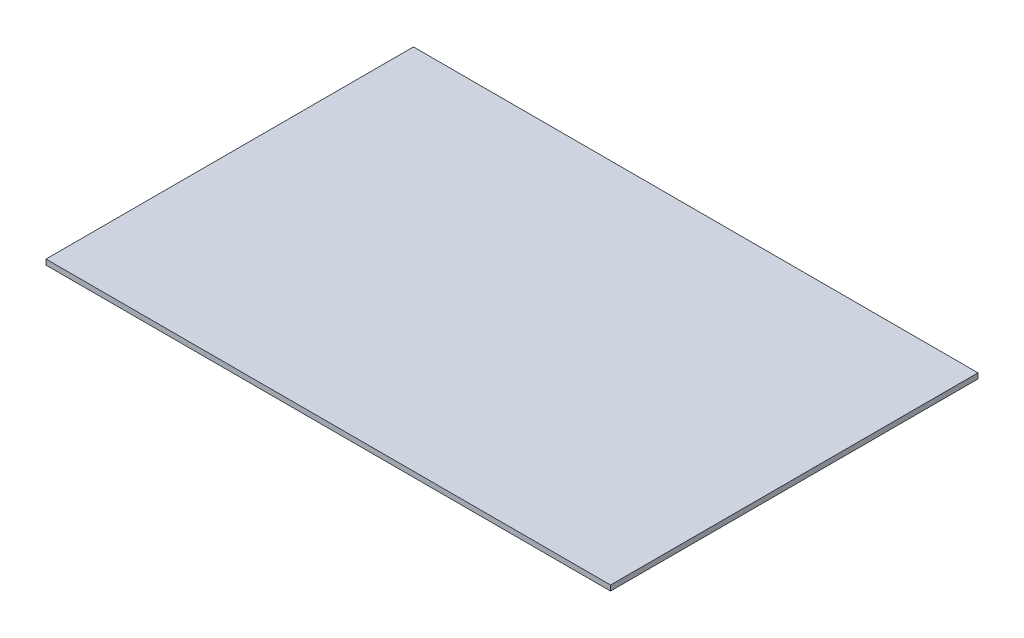
ISO-10303-21;
HEADER;
FILE_DESCRIPTION(('STEP AP214'),'2;1');
FILE_NAME('part.step','',(''),(''),'','','');
FILE_SCHEMA(('AUTOMOTIVE_DESIGN { 1 0 10303 214 1 1 1 1 }'));
ENDSEC;
DATA;
#1=APPLICATION_CONTEXT('core data for automotive mechanical design processes');
#2=APPLICATION_PROTOCOL_DEFINITION('international standard','automotive_design',2000,#1);
#3=PRODUCT_CONTEXT('',#1,'mechanical');
#4=PRODUCT('Part','Part','',(#3));
#5=PRODUCT_RELATED_PRODUCT_CATEGORY('part','',(#4));
#6=PRODUCT_DEFINITION_FORMATION('','',#4);
#7=PRODUCT_DEFINITION_CONTEXT('part definition',#1,'design');
#8=PRODUCT_DEFINITION('design','',#6,#7);
#9=PRODUCT_DEFINITION_SHAPE('','',#8);
#10=(LENGTH_UNIT() NAMED_UNIT(*) SI_UNIT(.MILLI.,.METRE.));
#11=(NAMED_UNIT(*) PLANE_ANGLE_UNIT() SI_UNIT($,.RADIAN.));
#12=(NAMED_UNIT(*) SI_UNIT($,.STERADIAN.) SOLID_ANGLE_UNIT());
#13=UNCERTAINTY_MEASURE_WITH_UNIT(LENGTH_MEASURE(1.E-05),#10,'distance_accuracy_value','');
#14=(GEOMETRIC_REPRESENTATION_CONTEXT(3) GLOBAL_UNCERTAINTY_ASSIGNED_CONTEXT((#13)) GLOBAL_UNIT_ASSIGNED_CONTEXT((#10,
#11,#12)) REPRESENTATION_CONTEXT('',''));
#15=CARTESIAN_POINT('',(0.,0.,0.));
#16=DIRECTION('',(0.,0.,1.));
#17=DIRECTION('',(1.,0.,0.));
#18=AXIS2_PLACEMENT_3D('',#15,#16,#17);
#19=CARTESIAN_POINT('',(160.,3.,-104.14));
#20=DIRECTION('',(-1.,0.,0.));
#21=DIRECTION('',(0.,0.,1.));
#22=AXIS2_PLACEMENT_3D('',#19,#20,#21);
#23=PLANE('',#22);
#24=DIRECTION('',(0.,0.,-1.));
#25=VECTOR('',#24,1.);
#26=CARTESIAN_POINT('',(160.,0.,-104.14));
#27=LINE('',#26,#25);
#28=CARTESIAN_POINT('',(160.,0.,104.14));
#29=VERTEX_POINT('',#28);
#30=CARTESIAN_POINT('',(160.,0.,-104.14));
#31=VERTEX_POINT('',#30);
#32=EDGE_CURVE('E98',#29,#31,#27,.T.);
#33=ORIENTED_EDGE('',*,*,#32,.T.);
#34=DIRECTION('',(0.,-1.,0.));
#35=VECTOR('',#34,1.);
#36=CARTESIAN_POINT('',(160.,3.,-104.14));
#37=LINE('',#36,#35);
#38=CARTESIAN_POINT('',(160.,3.,-104.14));
#39=VERTEX_POINT('',#38);
#40=EDGE_CURVE('E11',#39,#31,#37,.T.);
#41=ORIENTED_EDGE('',*,*,#40,.F.);
#42=DIRECTION('',(0.,0.,-1.));
#43=VECTOR('',#42,1.);
#44=CARTESIAN_POINT('',(160.,3.,-104.14));
#45=LINE('',#44,#43);
#46=CARTESIAN_POINT('',(160.,3.,104.14));
#47=VERTEX_POINT('',#46);
#48=EDGE_CURVE('E86',#47,#39,#45,.T.);
#49=ORIENTED_EDGE('',*,*,#48,.F.);
#50=DIRECTION('',(0.,-1.,0.));
#51=VECTOR('',#50,1.);
#52=CARTESIAN_POINT('',(160.,3.,104.14));
#53=LINE('',#52,#51);
#54=EDGE_CURVE('E94',#47,#29,#53,.T.);
#55=ORIENTED_EDGE('',*,*,#54,.T.);
#56=EDGE_LOOP('',(#33,#41,#49,#55));
#57=FACE_BOUND('',#56,.T.);
#58=ADVANCED_FACE('F35',(#57),#23,.F.);
#59=CARTESIAN_POINT('',(-160.,3.,-104.14));
#60=DIRECTION('',(0.,0.,1.));
#61=DIRECTION('',(1.,0.,0.));
#62=AXIS2_PLACEMENT_3D('',#59,#60,#61);
#63=PLANE('',#62);
#64=DIRECTION('',(-1.,0.,0.));
#65=VECTOR('',#64,1.);
#66=CARTESIAN_POINT('',(-160.,0.,-104.14));
#67=LINE('',#66,#65);
#68=CARTESIAN_POINT('',(-160.,0.,-104.14));
#69=VERTEX_POINT('',#68);
#70=EDGE_CURVE('E90',#31,#69,#67,.T.);
#71=ORIENTED_EDGE('',*,*,#70,.T.);
#72=DIRECTION('',(0.,-1.,0.));
#73=VECTOR('',#72,1.);
#74=CARTESIAN_POINT('',(-160.,3.,-104.14));
#75=LINE('',#74,#73);
#76=CARTESIAN_POINT('',(-160.,3.,-104.14));
#77=VERTEX_POINT('',#76);
#78=EDGE_CURVE('E43',#77,#69,#75,.T.);
#79=ORIENTED_EDGE('',*,*,#78,.F.);
#80=DIRECTION('',(-1.,0.,0.));
#81=VECTOR('',#80,1.);
#82=CARTESIAN_POINT('',(-160.,3.,-104.14));
#83=LINE('',#82,#81);
#84=EDGE_CURVE('E81',#39,#77,#83,.T.);
#85=ORIENTED_EDGE('',*,*,#84,.F.);
#86=ORIENTED_EDGE('',*,*,#40,.T.);
#87=EDGE_LOOP('',(#71,#79,#85,#86));
#88=FACE_BOUND('',#87,.T.);
#89=ADVANCED_FACE('F89',(#88),#63,.F.);
#90=CARTESIAN_POINT('',(-160.,3.,-104.14));
#91=DIRECTION('',(1.,0.,0.));
#92=DIRECTION('',(0.,0.,-1.));
#93=AXIS2_PLACEMENT_3D('',#90,#91,#92);
#94=PLANE('',#93);
#95=DIRECTION('',(0.,0.,1.));
#96=VECTOR('',#95,1.);
#97=CARTESIAN_POINT('',(-160.,0.,-104.14));
#98=LINE('',#97,#96);
#99=CARTESIAN_POINT('',(-160.,0.,104.14));
#100=VERTEX_POINT('',#99);
#101=EDGE_CURVE('E68',#69,#100,#98,.T.);
#102=ORIENTED_EDGE('',*,*,#101,.T.);
#103=DIRECTION('',(0.,-1.,0.));
#104=VECTOR('',#103,1.);
#105=CARTESIAN_POINT('',(-160.,3.,104.14));
#106=LINE('',#105,#104);
#107=CARTESIAN_POINT('',(-160.,3.,104.14));
#108=VERTEX_POINT('',#107);
#109=EDGE_CURVE('E91',#108,#100,#106,.T.);
#110=ORIENTED_EDGE('',*,*,#109,.F.);
#111=DIRECTION('',(0.,0.,1.));
#112=VECTOR('',#111,1.);
#113=CARTESIAN_POINT('',(-160.,3.,-104.14));
#114=LINE('',#113,#112);
#115=EDGE_CURVE('E84',#77,#108,#114,.T.);
#116=ORIENTED_EDGE('',*,*,#115,.F.);
#117=ORIENTED_EDGE('',*,*,#78,.T.);
#118=EDGE_LOOP('',(#102,#110,#116,#117));
#119=FACE_BOUND('',#118,.T.);
#120=ADVANCED_FACE('F92',(#119),#94,.F.);
#121=CARTESIAN_POINT('',(-160.,3.,104.14));
#122=DIRECTION('',(0.,0.,-1.));
#123=DIRECTION('',(-1.,0.,0.));
#124=AXIS2_PLACEMENT_3D('',#121,#122,#123);
#125=PLANE('',#124);
#126=DIRECTION('',(1.,0.,0.));
#127=VECTOR('',#126,1.);
#128=CARTESIAN_POINT('',(-160.,0.,104.14));
#129=LINE('',#128,#127);
#130=EDGE_CURVE('E74',#100,#29,#129,.T.);
#131=ORIENTED_EDGE('',*,*,#130,.T.);
#132=ORIENTED_EDGE('',*,*,#54,.F.);
#133=DIRECTION('',(1.,0.,0.));
#134=VECTOR('',#133,1.);
#135=CARTESIAN_POINT('',(-160.,3.,104.14));
#136=LINE('',#135,#134);
#137=EDGE_CURVE('E51',#108,#47,#136,.T.);
#138=ORIENTED_EDGE('',*,*,#137,.F.);
#139=ORIENTED_EDGE('',*,*,#109,.T.);
#140=EDGE_LOOP('',(#131,#132,#138,#139));
#141=FACE_BOUND('',#140,.T.);
#142=ADVANCED_FACE('F105',(#141),#125,.F.);
#143=CARTESIAN_POINT('',(0.,3.,0.));
#144=DIRECTION('',(0.,1.,0.));
#145=DIRECTION('',(0.,0.,1.));
#146=AXIS2_PLACEMENT_3D('',#143,#144,#145);
#147=PLANE('',#146);
#148=ORIENTED_EDGE('',*,*,#48,.T.);
#149=ORIENTED_EDGE('',*,*,#84,.T.);
#150=ORIENTED_EDGE('',*,*,#115,.T.);
#151=ORIENTED_EDGE('',*,*,#137,.T.);
#152=EDGE_LOOP('',(#148,#149,#150,#151));
#153=FACE_BOUND('',#152,.T.);
#154=ADVANCED_FACE('F82',(#153),#147,.T.);
#155=CARTESIAN_POINT('',(0.,0.,0.));
#156=DIRECTION('',(0.,1.,0.));
#157=DIRECTION('',(0.,0.,1.));
#158=AXIS2_PLACEMENT_3D('',#155,#156,#157);
#159=PLANE('',#158);
#160=ORIENTED_EDGE('',*,*,#32,.F.);
#161=ORIENTED_EDGE('',*,*,#130,.F.);
#162=ORIENTED_EDGE('',*,*,#101,.F.);
#163=ORIENTED_EDGE('',*,*,#70,.F.);
#164=EDGE_LOOP('',(#160,#161,#162,#163));
#165=FACE_BOUND('',#164,.T.);
#166=ADVANCED_FACE('F108',(#165),#159,.F.);
#167=CLOSED_SHELL('',(#58,#89,#120,#142,#154,#166));
#168=MANIFOLD_SOLID_BREP('B2',#167);
#169=ADVANCED_BREP_SHAPE_REPRESENTATION('',(#18,#168),#14);
#170=SHAPE_DEFINITION_REPRESENTATION(#9,#169);
ENDSEC;
END-ISO-10303-21;
